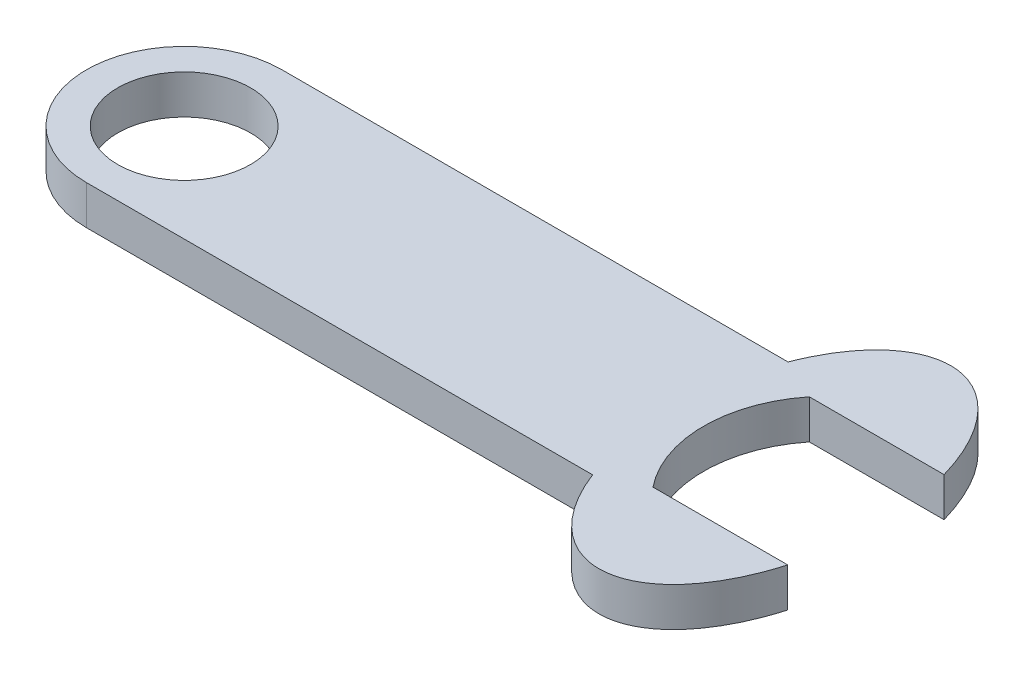
ISO-10303-21;
HEADER;
FILE_DESCRIPTION(('STEP AP214'),'2;1');
FILE_NAME('part.step','',(''),(''),'','','');
FILE_SCHEMA(('AUTOMOTIVE_DESIGN { 1 0 10303 214 1 1 1 1 }'));
ENDSEC;
DATA;
#1=APPLICATION_CONTEXT('core data for automotive mechanical design processes');
#2=APPLICATION_PROTOCOL_DEFINITION('international standard','automotive_design',2000,#1);
#3=PRODUCT_CONTEXT('',#1,'mechanical');
#4=PRODUCT('Part','Part','',(#3));
#5=PRODUCT_RELATED_PRODUCT_CATEGORY('part','',(#4));
#6=PRODUCT_DEFINITION_FORMATION('','',#4);
#7=PRODUCT_DEFINITION_CONTEXT('part definition',#1,'design');
#8=PRODUCT_DEFINITION('design','',#6,#7);
#9=PRODUCT_DEFINITION_SHAPE('','',#8);
#10=(LENGTH_UNIT() NAMED_UNIT(*) SI_UNIT(.MILLI.,.METRE.));
#11=(NAMED_UNIT(*) PLANE_ANGLE_UNIT() SI_UNIT($,.RADIAN.));
#12=(NAMED_UNIT(*) SI_UNIT($,.STERADIAN.) SOLID_ANGLE_UNIT());
#13=UNCERTAINTY_MEASURE_WITH_UNIT(LENGTH_MEASURE(1.E-05),#10,'distance_accuracy_value','');
#14=(GEOMETRIC_REPRESENTATION_CONTEXT(3) GLOBAL_UNCERTAINTY_ASSIGNED_CONTEXT((#13)) GLOBAL_UNIT_ASSIGNED_CONTEXT((#10,
#11,#12)) REPRESENTATION_CONTEXT('',''));
#15=CARTESIAN_POINT('',(0.,0.,0.));
#16=DIRECTION('',(0.,0.,1.));
#17=DIRECTION('',(1.,0.,0.));
#18=AXIS2_PLACEMENT_3D('',#15,#16,#17);
#19=CARTESIAN_POINT('',(151.1,10.,0.));
#20=DIRECTION('',(0.,1.,0.));
#21=DIRECTION('',(0.,0.,1.));
#22=AXIS2_PLACEMENT_3D('',#19,#20,#21);
#23=PLANE('',#22);
#24=CARTESIAN_POINT('',(0.,10.,0.));
#25=DIRECTION('',(0.,1.,0.));
#26=DIRECTION('',(0.,0.,1.));
#27=AXIS2_PLACEMENT_3D('',#24,#25,#26);
#28=CIRCLE('',#27,25.);
#29=CARTESIAN_POINT('',(0.,10.,-25.));
#30=VERTEX_POINT('',#29);
#31=CARTESIAN_POINT('',(0.,10.,25.));
#32=VERTEX_POINT('',#31);
#33=EDGE_CURVE('E195',#30,#32,#28,.T.);
#34=ORIENTED_EDGE('',*,*,#33,.T.);
#35=DIRECTION('',(1.,0.,0.));
#36=VECTOR('',#35,1.);
#37=CARTESIAN_POINT('',(0.,10.,25.));
#38=LINE('',#37,#36);
#39=CARTESIAN_POINT('',(129.481535098639,10.,25.));
#40=VERTEX_POINT('',#39);
#41=EDGE_CURVE('E97',#32,#40,#38,.T.);
#42=ORIENTED_EDGE('',*,*,#41,.T.);
#43=CARTESIAN_POINT('',(151.1,10.,0.));
#44=DIRECTION('',(0.,1.,0.));
#45=DIRECTION('',(0.,0.,1.));
#46=AXIS2_PLACEMENT_3D('',#43,#44,#45);
#47=ELLIPSE('',#46,45.,26.);
#48=CARTESIAN_POINT('',(174.390966828418,10.,20.));
#49=VERTEX_POINT('',#48);
#50=EDGE_CURVE('E156',#40,#49,#47,.T.);
#51=ORIENTED_EDGE('',*,*,#50,.T.);
#52=DIRECTION('',(-1.,0.,0.));
#53=VECTOR('',#52,1.);
#54=CARTESIAN_POINT('',(139.920082606021,10.,20.));
#55=LINE('',#54,#53);
#56=CARTESIAN_POINT('',(139.920082606021,10.,20.));
#57=VERTEX_POINT('',#56);
#58=EDGE_CURVE('E160',#49,#57,#55,.T.);
#59=ORIENTED_EDGE('',*,*,#58,.T.);
#60=CARTESIAN_POINT('',(164.899999999994,10.,0.));
#61=DIRECTION('',(0.,-1.,0.));
#62=DIRECTION('',(0.,0.,-1.));
#63=AXIS2_PLACEMENT_3D('',#60,#61,#62);
#64=CIRCLE('',#63,31.9999417657243);
#65=CARTESIAN_POINT('',(139.920082606021,10.,-20.));
#66=VERTEX_POINT('',#65);
#67=EDGE_CURVE('E116',#57,#66,#64,.T.);
#68=ORIENTED_EDGE('',*,*,#67,.T.);
#69=DIRECTION('',(1.,0.,0.));
#70=VECTOR('',#69,1.);
#71=CARTESIAN_POINT('',(139.920082606021,10.,-20.));
#72=LINE('',#71,#70);
#73=CARTESIAN_POINT('',(174.390966828418,10.,-20.));
#74=VERTEX_POINT('',#73);
#75=EDGE_CURVE('E110',#66,#74,#72,.T.);
#76=ORIENTED_EDGE('',*,*,#75,.T.);
#77=CARTESIAN_POINT('',(151.1,10.,0.));
#78=DIRECTION('',(0.,1.,0.));
#79=DIRECTION('',(0.,0.,1.));
#80=AXIS2_PLACEMENT_3D('',#77,#78,#79);
#81=ELLIPSE('',#80,45.,26.);
#82=CARTESIAN_POINT('',(129.481535098639,10.,-25.));
#83=VERTEX_POINT('',#82);
#84=EDGE_CURVE('E114',#74,#83,#81,.T.);
#85=ORIENTED_EDGE('',*,*,#84,.T.);
#86=DIRECTION('',(-1.,0.,0.));
#87=VECTOR('',#86,1.);
#88=CARTESIAN_POINT('',(0.,10.,-25.));
#89=LINE('',#88,#87);
#90=EDGE_CURVE('E54',#83,#30,#89,.T.);
#91=ORIENTED_EDGE('',*,*,#90,.T.);
#92=EDGE_LOOP('',(#34,#42,#51,#59,#68,#76,#85,#91));
#93=FACE_BOUND('',#92,.T.);
#94=CARTESIAN_POINT('',(0.,10.,0.));
#95=DIRECTION('',(0.,1.,0.));
#96=DIRECTION('',(0.,0.,1.));
#97=AXIS2_PLACEMENT_3D('',#94,#95,#96);
#98=CIRCLE('',#97,17.);
#99=CARTESIAN_POINT('',(0.,10.,17.));
#100=VERTEX_POINT('',#99);
#101=EDGE_CURVE('E199',#100,#100,#98,.T.);
#102=ORIENTED_EDGE('',*,*,#101,.F.);
#103=EDGE_LOOP('',(#102));
#104=FACE_BOUND('',#103,.T.);
#105=ADVANCED_FACE('F37',(#93,#104),#23,.T.);
#106=CARTESIAN_POINT('',(151.1,0.,0.));
#107=DIRECTION('',(0.,1.,0.));
#108=DIRECTION('',(0.,0.,1.));
#109=AXIS2_PLACEMENT_3D('',#106,#107,#108);
#110=PLANE('',#109);
#111=CARTESIAN_POINT('',(0.,0.,0.));
#112=DIRECTION('',(0.,1.,0.));
#113=DIRECTION('',(0.,0.,1.));
#114=AXIS2_PLACEMENT_3D('',#111,#112,#113);
#115=CIRCLE('',#114,25.);
#116=CARTESIAN_POINT('',(0.,0.,-25.));
#117=VERTEX_POINT('',#116);
#118=CARTESIAN_POINT('',(0.,0.,25.));
#119=VERTEX_POINT('',#118);
#120=EDGE_CURVE('E188',#117,#119,#115,.T.);
#121=ORIENTED_EDGE('',*,*,#120,.F.);
#122=DIRECTION('',(-1.,0.,0.));
#123=VECTOR('',#122,1.);
#124=CARTESIAN_POINT('',(0.,0.,-25.));
#125=LINE('',#124,#123);
#126=CARTESIAN_POINT('',(129.481535098639,0.,-25.));
#127=VERTEX_POINT('',#126);
#128=EDGE_CURVE('E89',#127,#117,#125,.T.);
#129=ORIENTED_EDGE('',*,*,#128,.F.);
#130=CARTESIAN_POINT('',(151.1,0.,0.));
#131=DIRECTION('',(0.,1.,0.));
#132=DIRECTION('',(0.,0.,1.));
#133=AXIS2_PLACEMENT_3D('',#130,#131,#132);
#134=ELLIPSE('',#133,45.,26.);
#135=CARTESIAN_POINT('',(174.390966828418,0.,-20.));
#136=VERTEX_POINT('',#135);
#137=EDGE_CURVE('E83',#136,#127,#134,.T.);
#138=ORIENTED_EDGE('',*,*,#137,.F.);
#139=DIRECTION('',(1.,0.,0.));
#140=VECTOR('',#139,1.);
#141=CARTESIAN_POINT('',(139.920082606021,0.,-20.));
#142=LINE('',#141,#140);
#143=CARTESIAN_POINT('',(139.920082606021,0.,-20.));
#144=VERTEX_POINT('',#143);
#145=EDGE_CURVE('E124',#144,#136,#142,.T.);
#146=ORIENTED_EDGE('',*,*,#145,.F.);
#147=CARTESIAN_POINT('',(164.899999999994,0.,0.));
#148=DIRECTION('',(0.,-1.,0.));
#149=DIRECTION('',(0.,0.,-1.));
#150=AXIS2_PLACEMENT_3D('',#147,#148,#149);
#151=CIRCLE('',#150,31.9999417657243);
#152=CARTESIAN_POINT('',(139.920082606021,0.,20.));
#153=VERTEX_POINT('',#152);
#154=EDGE_CURVE('E174',#153,#144,#151,.T.);
#155=ORIENTED_EDGE('',*,*,#154,.F.);
#156=DIRECTION('',(-1.,0.,0.));
#157=VECTOR('',#156,1.);
#158=CARTESIAN_POINT('',(139.920082606021,0.,20.));
#159=LINE('',#158,#157);
#160=CARTESIAN_POINT('',(174.390966828418,0.,20.));
#161=VERTEX_POINT('',#160);
#162=EDGE_CURVE('E170',#161,#153,#159,.T.);
#163=ORIENTED_EDGE('',*,*,#162,.F.);
#164=CARTESIAN_POINT('',(151.1,0.,0.));
#165=DIRECTION('',(0.,1.,0.));
#166=DIRECTION('',(0.,0.,1.));
#167=AXIS2_PLACEMENT_3D('',#164,#165,#166);
#168=ELLIPSE('',#167,45.,26.);
#169=CARTESIAN_POINT('',(129.481535098639,0.,25.));
#170=VERTEX_POINT('',#169);
#171=EDGE_CURVE('E180',#170,#161,#168,.T.);
#172=ORIENTED_EDGE('',*,*,#171,.F.);
#173=DIRECTION('',(1.,0.,0.));
#174=VECTOR('',#173,1.);
#175=CARTESIAN_POINT('',(0.,0.,25.));
#176=LINE('',#175,#174);
#177=EDGE_CURVE('E185',#119,#170,#176,.T.);
#178=ORIENTED_EDGE('',*,*,#177,.F.);
#179=EDGE_LOOP('',(#121,#129,#138,#146,#155,#163,#172,#178));
#180=FACE_BOUND('',#179,.T.);
#181=CARTESIAN_POINT('',(0.,0.,0.));
#182=DIRECTION('',(0.,1.,0.));
#183=DIRECTION('',(0.,0.,1.));
#184=AXIS2_PLACEMENT_3D('',#181,#182,#183);
#185=CIRCLE('',#184,17.);
#186=CARTESIAN_POINT('',(0.,0.,17.));
#187=VERTEX_POINT('',#186);
#188=EDGE_CURVE('E201',#187,#187,#185,.T.);
#189=ORIENTED_EDGE('',*,*,#188,.T.);
#190=EDGE_LOOP('',(#189));
#191=FACE_BOUND('',#190,.T.);
#192=ADVANCED_FACE('F183',(#180,#191),#110,.F.);
#193=CARTESIAN_POINT('',(0.,10.,0.));
#194=DIRECTION('',(0.,-1.,0.));
#195=DIRECTION('',(0.,0.,-1.));
#196=AXIS2_PLACEMENT_3D('',#193,#194,#195);
#197=CYLINDRICAL_SURFACE('',#196,25.);
#198=ORIENTED_EDGE('',*,*,#120,.T.);
#199=DIRECTION('',(0.,-1.,0.));
#200=VECTOR('',#199,1.);
#201=CARTESIAN_POINT('',(0.,10.,25.));
#202=LINE('',#201,#200);
#203=EDGE_CURVE('E11',#32,#119,#202,.T.);
#204=ORIENTED_EDGE('',*,*,#203,.F.);
#205=ORIENTED_EDGE('',*,*,#33,.F.);
#206=DIRECTION('',(0.,-1.,0.));
#207=VECTOR('',#206,1.);
#208=CARTESIAN_POINT('',(0.,10.,-25.));
#209=LINE('',#208,#207);
#210=EDGE_CURVE('E130',#30,#117,#209,.T.);
#211=ORIENTED_EDGE('',*,*,#210,.T.);
#212=EDGE_LOOP('',(#198,#204,#205,#211));
#213=FACE_BOUND('',#212,.T.);
#214=ADVANCED_FACE('F39',(#213),#197,.T.);
#215=CARTESIAN_POINT('',(0.,10.,25.));
#216=DIRECTION('',(0.,0.,-1.));
#217=DIRECTION('',(-1.,0.,0.));
#218=AXIS2_PLACEMENT_3D('',#215,#216,#217);
#219=PLANE('',#218);
#220=ORIENTED_EDGE('',*,*,#177,.T.);
#221=DIRECTION('',(0.,-1.,0.));
#222=VECTOR('',#221,1.);
#223=CARTESIAN_POINT('',(129.481535098639,10.,25.));
#224=LINE('',#223,#222);
#225=EDGE_CURVE('E46',#40,#170,#224,.T.);
#226=ORIENTED_EDGE('',*,*,#225,.F.);
#227=ORIENTED_EDGE('',*,*,#41,.F.);
#228=ORIENTED_EDGE('',*,*,#203,.T.);
#229=EDGE_LOOP('',(#220,#226,#227,#228));
#230=FACE_BOUND('',#229,.T.);
#231=ADVANCED_FACE('F154',(#230),#219,.F.);
#232=DIRECTION('',(0.,-1.,0.));
#233=VECTOR('',#232,1.);
#234=SURFACE_OF_LINEAR_EXTRUSION('',#47,#233);
#235=ORIENTED_EDGE('',*,*,#171,.T.);
#236=DIRECTION('',(0.,-1.,0.));
#237=VECTOR('',#236,1.);
#238=CARTESIAN_POINT('',(174.390966828418,10.,20.));
#239=LINE('',#238,#237);
#240=EDGE_CURVE('E172',#49,#161,#239,.T.);
#241=ORIENTED_EDGE('',*,*,#240,.F.);
#242=ORIENTED_EDGE('',*,*,#50,.F.);
#243=ORIENTED_EDGE('',*,*,#225,.T.);
#244=EDGE_LOOP('',(#235,#241,#242,#243));
#245=FACE_BOUND('',#244,.T.);
#246=ADVANCED_FACE('F150',(#245),#234,.F.);
#247=CARTESIAN_POINT('',(139.920082606021,10.,20.));
#248=DIRECTION('',(0.,0.,1.));
#249=DIRECTION('',(1.,0.,0.));
#250=AXIS2_PLACEMENT_3D('',#247,#248,#249);
#251=PLANE('',#250);
#252=ORIENTED_EDGE('',*,*,#162,.T.);
#253=DIRECTION('',(0.,-1.,0.));
#254=VECTOR('',#253,1.);
#255=CARTESIAN_POINT('',(139.920082606021,10.,20.));
#256=LINE('',#255,#254);
#257=EDGE_CURVE('E168',#57,#153,#256,.T.);
#258=ORIENTED_EDGE('',*,*,#257,.F.);
#259=ORIENTED_EDGE('',*,*,#58,.F.);
#260=ORIENTED_EDGE('',*,*,#240,.T.);
#261=EDGE_LOOP('',(#252,#258,#259,#260));
#262=FACE_BOUND('',#261,.T.);
#263=ADVANCED_FACE('F146',(#262),#251,.F.);
#264=CARTESIAN_POINT('',(164.899999999994,10.,0.));
#265=DIRECTION('',(0.,-1.,0.));
#266=DIRECTION('',(0.,0.,-1.));
#267=AXIS2_PLACEMENT_3D('',#264,#265,#266);
#268=CYLINDRICAL_SURFACE('',#267,31.9999417657243);
#269=ORIENTED_EDGE('',*,*,#154,.T.);
#270=DIRECTION('',(0.,-1.,0.));
#271=VECTOR('',#270,1.);
#272=CARTESIAN_POINT('',(139.920082606021,10.,-20.));
#273=LINE('',#272,#271);
#274=EDGE_CURVE('E125',#66,#144,#273,.T.);
#275=ORIENTED_EDGE('',*,*,#274,.F.);
#276=ORIENTED_EDGE('',*,*,#67,.F.);
#277=ORIENTED_EDGE('',*,*,#257,.T.);
#278=EDGE_LOOP('',(#269,#275,#276,#277));
#279=FACE_BOUND('',#278,.T.);
#280=ADVANCED_FACE('F143',(#279),#268,.F.);
#281=CARTESIAN_POINT('',(139.920082606021,10.,-20.));
#282=DIRECTION('',(0.,0.,-1.));
#283=DIRECTION('',(-1.,0.,0.));
#284=AXIS2_PLACEMENT_3D('',#281,#282,#283);
#285=PLANE('',#284);
#286=ORIENTED_EDGE('',*,*,#145,.T.);
#287=DIRECTION('',(0.,-1.,0.));
#288=VECTOR('',#287,1.);
#289=CARTESIAN_POINT('',(174.390966828418,10.,-20.));
#290=LINE('',#289,#288);
#291=EDGE_CURVE('E121',#74,#136,#290,.T.);
#292=ORIENTED_EDGE('',*,*,#291,.F.);
#293=ORIENTED_EDGE('',*,*,#75,.F.);
#294=ORIENTED_EDGE('',*,*,#274,.T.);
#295=EDGE_LOOP('',(#286,#292,#293,#294));
#296=FACE_BOUND('',#295,.T.);
#297=ADVANCED_FACE('F122',(#296),#285,.F.);
#298=DIRECTION('',(0.,-1.,0.));
#299=VECTOR('',#298,1.);
#300=SURFACE_OF_LINEAR_EXTRUSION('',#81,#299);
#301=ORIENTED_EDGE('',*,*,#137,.T.);
#302=DIRECTION('',(0.,-1.,0.));
#303=VECTOR('',#302,1.);
#304=CARTESIAN_POINT('',(129.481535098639,10.,-25.));
#305=LINE('',#304,#303);
#306=EDGE_CURVE('E126',#83,#127,#305,.T.);
#307=ORIENTED_EDGE('',*,*,#306,.F.);
#308=ORIENTED_EDGE('',*,*,#84,.F.);
#309=ORIENTED_EDGE('',*,*,#291,.T.);
#310=EDGE_LOOP('',(#301,#307,#308,#309));
#311=FACE_BOUND('',#310,.T.);
#312=ADVANCED_FACE('F128',(#311),#300,.F.);
#313=CARTESIAN_POINT('',(0.,10.,-25.));
#314=DIRECTION('',(0.,0.,1.));
#315=DIRECTION('',(1.,0.,0.));
#316=AXIS2_PLACEMENT_3D('',#313,#314,#315);
#317=PLANE('',#316);
#318=ORIENTED_EDGE('',*,*,#128,.T.);
#319=ORIENTED_EDGE('',*,*,#210,.F.);
#320=ORIENTED_EDGE('',*,*,#90,.F.);
#321=ORIENTED_EDGE('',*,*,#306,.T.);
#322=EDGE_LOOP('',(#318,#319,#320,#321));
#323=FACE_BOUND('',#322,.T.);
#324=ADVANCED_FACE('F139',(#323),#317,.F.);
#325=CARTESIAN_POINT('',(0.,10.,0.));
#326=DIRECTION('',(0.,-1.,0.));
#327=DIRECTION('',(0.,0.,-1.));
#328=AXIS2_PLACEMENT_3D('',#325,#326,#327);
#329=CYLINDRICAL_SURFACE('',#328,17.);
#330=ORIENTED_EDGE('',*,*,#101,.T.);
#331=EDGE_LOOP('',(#330));
#332=FACE_BOUND('',#331,.T.);
#333=ORIENTED_EDGE('',*,*,#188,.F.);
#334=EDGE_LOOP('',(#333));
#335=FACE_BOUND('',#334,.T.);
#336=ADVANCED_FACE('F218',(#332,#335),#329,.F.);
#337=CLOSED_SHELL('',(#105,#192,#214,#231,#246,#263,#280,#297,#312,#324,#336));
#338=MANIFOLD_SOLID_BREP('B2',#337);
#339=ADVANCED_BREP_SHAPE_REPRESENTATION('',(#18,#338),#14);
#340=SHAPE_DEFINITION_REPRESENTATION(#9,#339);
ENDSEC;
END-ISO-10303-21;
